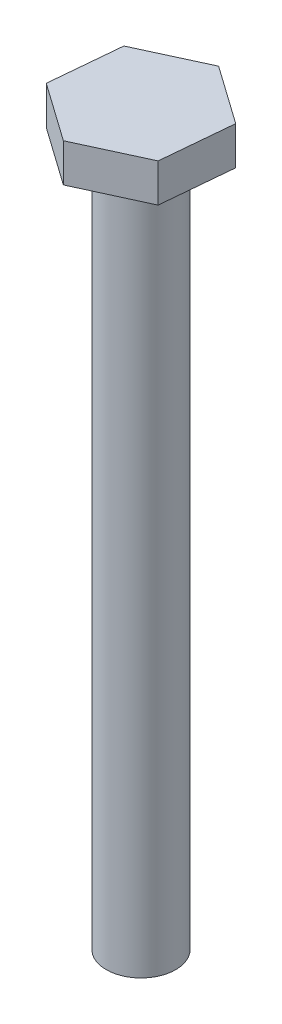
ISO-10303-21;
HEADER;
FILE_DESCRIPTION(('STEP AP214'),'2;1');
FILE_NAME('part.step','',(''),(''),'','','');
FILE_SCHEMA(('AUTOMOTIVE_DESIGN { 1 0 10303 214 1 1 1 1 }'));
ENDSEC;
DATA;
#1=APPLICATION_CONTEXT('core data for automotive mechanical design processes');
#2=APPLICATION_PROTOCOL_DEFINITION('international standard','automotive_design',2000,#1);
#3=PRODUCT_CONTEXT('',#1,'mechanical');
#4=PRODUCT('Part','Part','',(#3));
#5=PRODUCT_RELATED_PRODUCT_CATEGORY('part','',(#4));
#6=PRODUCT_DEFINITION_FORMATION('','',#4);
#7=PRODUCT_DEFINITION_CONTEXT('part definition',#1,'design');
#8=PRODUCT_DEFINITION('design','',#6,#7);
#9=PRODUCT_DEFINITION_SHAPE('','',#8);
#10=(LENGTH_UNIT() NAMED_UNIT(*) SI_UNIT(.MILLI.,.METRE.));
#11=(NAMED_UNIT(*) PLANE_ANGLE_UNIT() SI_UNIT($,.RADIAN.));
#12=(NAMED_UNIT(*) SI_UNIT($,.STERADIAN.) SOLID_ANGLE_UNIT());
#13=UNCERTAINTY_MEASURE_WITH_UNIT(LENGTH_MEASURE(1.E-05),#10,'distance_accuracy_value','');
#14=(GEOMETRIC_REPRESENTATION_CONTEXT(3) GLOBAL_UNCERTAINTY_ASSIGNED_CONTEXT((#13)) GLOBAL_UNIT_ASSIGNED_CONTEXT((#10,
#11,#12)) REPRESENTATION_CONTEXT('',''));
#15=CARTESIAN_POINT('',(0.,0.,0.));
#16=DIRECTION('',(0.,0.,1.));
#17=DIRECTION('',(1.,0.,0.));
#18=AXIS2_PLACEMENT_3D('',#15,#16,#17);
#19=CARTESIAN_POINT('',(0.,-127.,0.));
#20=DIRECTION('',(0.,1.,0.));
#21=DIRECTION('',(0.,0.,1.));
#22=AXIS2_PLACEMENT_3D('',#19,#20,#21);
#23=CYLINDRICAL_SURFACE('',#22,6.35);
#24=CARTESIAN_POINT('',(0.,-127.,0.));
#25=DIRECTION('',(0.,1.,0.));
#26=DIRECTION('',(0.,0.,1.));
#27=AXIS2_PLACEMENT_3D('',#24,#25,#26);
#28=CIRCLE('',#27,6.35);
#29=CARTESIAN_POINT('',(0.,-127.,6.35));
#30=VERTEX_POINT('',#29);
#31=EDGE_CURVE('E11',#30,#30,#28,.T.);
#32=ORIENTED_EDGE('',*,*,#31,.T.);
#33=EDGE_LOOP('',(#32));
#34=FACE_BOUND('',#33,.T.);
#35=CARTESIAN_POINT('',(0.,0.,0.));
#36=DIRECTION('',(0.,1.,0.));
#37=DIRECTION('',(0.,0.,1.));
#38=AXIS2_PLACEMENT_3D('',#35,#36,#37);
#39=CIRCLE('',#38,6.35);
#40=CARTESIAN_POINT('',(0.,0.,6.35));
#41=VERTEX_POINT('',#40);
#42=EDGE_CURVE('E40',#41,#41,#39,.T.);
#43=ORIENTED_EDGE('',*,*,#42,.F.);
#44=EDGE_LOOP('',(#43));
#45=FACE_BOUND('',#44,.T.);
#46=ADVANCED_FACE('F37',(#34,#45),#23,.T.);
#47=CARTESIAN_POINT('',(0.,-127.,0.));
#48=DIRECTION('',(0.,1.,0.));
#49=DIRECTION('',(0.,0.,1.));
#50=AXIS2_PLACEMENT_3D('',#47,#48,#49);
#51=PLANE('',#50);
#52=ORIENTED_EDGE('',*,*,#31,.F.);
#53=EDGE_LOOP('',(#52));
#54=FACE_BOUND('',#53,.T.);
#55=ADVANCED_FACE('F148',(#54),#51,.F.);
#56=CARTESIAN_POINT('',(-1.19320133421304,7.,13.));
#57=DIRECTION('',(-0.418751927777362,0.,-0.90810066786824));
#58=DIRECTION('',(-0.90810066786824,0.,0.418751927777362));
#59=AXIS2_PLACEMENT_3D('',#56,#57,#58);
#60=PLANE('',#59);
#61=DIRECTION('',(0.90810066786824,0.,-0.418751927777362));
#62=VECTOR('',#61,1.);
#63=CARTESIAN_POINT('',(-1.19320133421304,0.,13.));
#64=LINE('',#63,#62);
#65=CARTESIAN_POINT('',(-1.19320133421304,0.,13.));
#66=VERTEX_POINT('',#65);
#67=CARTESIAN_POINT('',(10.6617295820912,0.,7.53334266725798));
#68=VERTEX_POINT('',#67);
#69=EDGE_CURVE('E122',#66,#68,#64,.T.);
#70=ORIENTED_EDGE('',*,*,#69,.T.);
#71=DIRECTION('',(0.,-1.,0.));
#72=VECTOR('',#71,1.);
#73=CARTESIAN_POINT('',(10.6617295820912,7.,7.53334266725798));
#74=LINE('',#73,#72);
#75=CARTESIAN_POINT('',(10.6617295820912,7.,7.53334266725798));
#76=VERTEX_POINT('',#75);
#77=EDGE_CURVE('E139',#76,#68,#74,.T.);
#78=ORIENTED_EDGE('',*,*,#77,.F.);
#79=DIRECTION('',(0.90810066786824,0.,-0.418751927777362));
#80=VECTOR('',#79,1.);
#81=CARTESIAN_POINT('',(-1.19320133421304,7.,13.));
#82=LINE('',#81,#80);
#83=CARTESIAN_POINT('',(-1.19320133421304,7.,13.));
#84=VERTEX_POINT('',#83);
#85=EDGE_CURVE('E132',#84,#76,#82,.T.);
#86=ORIENTED_EDGE('',*,*,#85,.F.);
#87=DIRECTION('',(0.,-1.,0.));
#88=VECTOR('',#87,1.);
#89=CARTESIAN_POINT('',(-1.19320133421304,7.,13.));
#90=LINE('',#89,#88);
#91=EDGE_CURVE('E118',#84,#66,#90,.T.);
#92=ORIENTED_EDGE('',*,*,#91,.T.);
#93=EDGE_LOOP('',(#70,#78,#86,#92));
#94=FACE_BOUND('',#93,.T.);
#95=ADVANCED_FACE('F153',(#94),#60,.F.);
#96=CARTESIAN_POINT('',(10.6617295820912,7.,7.53334266725798));
#97=DIRECTION('',(-0.995814211456192,0.,-0.0914005265952182));
#98=DIRECTION('',(-0.0914005265952182,0.,0.995814211456192));
#99=AXIS2_PLACEMENT_3D('',#96,#97,#98);
#100=PLANE('',#99);
#101=DIRECTION('',(0.0914005265952182,0.,-0.995814211456192));
#102=VECTOR('',#101,1.);
#103=CARTESIAN_POINT('',(10.6617295820912,0.,7.53334266725798));
#104=LINE('',#103,#102);
#105=CARTESIAN_POINT('',(11.8549309163042,0.,-5.46665733274202));
#106=VERTEX_POINT('',#105);
#107=EDGE_CURVE('E125',#68,#106,#104,.T.);
#108=ORIENTED_EDGE('',*,*,#107,.T.);
#109=DIRECTION('',(0.,-1.,0.));
#110=VECTOR('',#109,1.);
#111=CARTESIAN_POINT('',(11.8549309163042,7.,-5.46665733274202));
#112=LINE('',#111,#110);
#113=CARTESIAN_POINT('',(11.8549309163042,7.,-5.46665733274202));
#114=VERTEX_POINT('',#113);
#115=EDGE_CURVE('E136',#114,#106,#112,.T.);
#116=ORIENTED_EDGE('',*,*,#115,.F.);
#117=DIRECTION('',(0.0914005265952182,0.,-0.995814211456192));
#118=VECTOR('',#117,1.);
#119=CARTESIAN_POINT('',(10.6617295820912,7.,7.53334266725798));
#120=LINE('',#119,#118);
#121=EDGE_CURVE('E91',#76,#114,#120,.T.);
#122=ORIENTED_EDGE('',*,*,#121,.F.);
#123=ORIENTED_EDGE('',*,*,#77,.T.);
#124=EDGE_LOOP('',(#108,#116,#122,#123));
#125=FACE_BOUND('',#124,.T.);
#126=ADVANCED_FACE('F159',(#125),#100,.F.);
#127=CARTESIAN_POINT('',(11.8549309163042,7.,-5.46665733274202));
#128=DIRECTION('',(-0.57706228367883,0.,0.816700141273021));
#129=DIRECTION('',(0.816700141273021,0.,0.57706228367883));
#130=AXIS2_PLACEMENT_3D('',#127,#128,#129);
#131=PLANE('',#130);
#132=DIRECTION('',(-0.816700141273022,0.,-0.57706228367883));
#133=VECTOR('',#132,1.);
#134=CARTESIAN_POINT('',(11.8549309163042,0.,-5.46665733274202));
#135=LINE('',#134,#133);
#136=CARTESIAN_POINT('',(1.19320133421305,0.,-13.));
#137=VERTEX_POINT('',#136);
#138=EDGE_CURVE('E127',#106,#137,#135,.T.);
#139=ORIENTED_EDGE('',*,*,#138,.T.);
#140=DIRECTION('',(0.,-1.,0.));
#141=VECTOR('',#140,1.);
#142=CARTESIAN_POINT('',(1.19320133421305,7.,-13.));
#143=LINE('',#142,#141);
#144=CARTESIAN_POINT('',(1.19320133421305,7.,-13.));
#145=VERTEX_POINT('',#144);
#146=EDGE_CURVE('E113',#145,#137,#143,.T.);
#147=ORIENTED_EDGE('',*,*,#146,.F.);
#148=DIRECTION('',(-0.816700141273022,0.,-0.57706228367883));
#149=VECTOR('',#148,1.);
#150=CARTESIAN_POINT('',(11.8549309163042,7.,-5.46665733274202));
#151=LINE('',#150,#149);
#152=EDGE_CURVE('E104',#114,#145,#151,.T.);
#153=ORIENTED_EDGE('',*,*,#152,.F.);
#154=ORIENTED_EDGE('',*,*,#115,.T.);
#155=EDGE_LOOP('',(#139,#147,#153,#154));
#156=FACE_BOUND('',#155,.T.);
#157=ADVANCED_FACE('F165',(#156),#131,.F.);
#158=CARTESIAN_POINT('',(1.19320133421305,7.,-13.));
#159=DIRECTION('',(0.418751927777362,0.,0.90810066786824));
#160=DIRECTION('',(0.90810066786824,0.,-0.418751927777362));
#161=AXIS2_PLACEMENT_3D('',#158,#159,#160);
#162=PLANE('',#161);
#163=DIRECTION('',(-0.90810066786824,0.,0.418751927777362));
#164=VECTOR('',#163,1.);
#165=CARTESIAN_POINT('',(1.19320133421305,0.,-13.));
#166=LINE('',#165,#164);
#167=CARTESIAN_POINT('',(-10.6617295820912,0.,-7.53334266725798));
#168=VERTEX_POINT('',#167);
#169=EDGE_CURVE('E112',#137,#168,#166,.T.);
#170=ORIENTED_EDGE('',*,*,#169,.T.);
#171=DIRECTION('',(0.,-1.,0.));
#172=VECTOR('',#171,1.);
#173=CARTESIAN_POINT('',(-10.6617295820912,7.,-7.53334266725798));
#174=LINE('',#173,#172);
#175=CARTESIAN_POINT('',(-10.6617295820912,7.,-7.53334266725798));
#176=VERTEX_POINT('',#175);
#177=EDGE_CURVE('E109',#176,#168,#174,.T.);
#178=ORIENTED_EDGE('',*,*,#177,.F.);
#179=DIRECTION('',(-0.90810066786824,0.,0.418751927777362));
#180=VECTOR('',#179,1.);
#181=CARTESIAN_POINT('',(1.19320133421305,7.,-13.));
#182=LINE('',#181,#180);
#183=EDGE_CURVE('E98',#145,#176,#182,.T.);
#184=ORIENTED_EDGE('',*,*,#183,.F.);
#185=ORIENTED_EDGE('',*,*,#146,.T.);
#186=EDGE_LOOP('',(#170,#178,#184,#185));
#187=FACE_BOUND('',#186,.T.);
#188=ADVANCED_FACE('F110',(#187),#162,.F.);
#189=CARTESIAN_POINT('',(-10.6617295820912,7.,-7.53334266725798));
#190=DIRECTION('',(0.995814211456192,0.,0.0914005265952182));
#191=DIRECTION('',(0.0914005265952182,0.,-0.995814211456192));
#192=AXIS2_PLACEMENT_3D('',#189,#190,#191);
#193=PLANE('',#192);
#194=DIRECTION('',(-0.0914005265952182,0.,0.995814211456192));
#195=VECTOR('',#194,1.);
#196=CARTESIAN_POINT('',(-10.6617295820912,0.,-7.53334266725798));
#197=LINE('',#196,#195);
#198=CARTESIAN_POINT('',(-11.8549309163042,0.,5.46665733274202));
#199=VERTEX_POINT('',#198);
#200=EDGE_CURVE('E76',#168,#199,#197,.T.);
#201=ORIENTED_EDGE('',*,*,#200,.T.);
#202=DIRECTION('',(0.,-1.,0.));
#203=VECTOR('',#202,1.);
#204=CARTESIAN_POINT('',(-11.8549309163042,7.,5.46665733274202));
#205=LINE('',#204,#203);
#206=CARTESIAN_POINT('',(-11.8549309163042,7.,5.46665733274202));
#207=VERTEX_POINT('',#206);
#208=EDGE_CURVE('E114',#207,#199,#205,.T.);
#209=ORIENTED_EDGE('',*,*,#208,.F.);
#210=DIRECTION('',(-0.0914005265952182,0.,0.995814211456192));
#211=VECTOR('',#210,1.);
#212=CARTESIAN_POINT('',(-10.6617295820912,7.,-7.53334266725798));
#213=LINE('',#212,#211);
#214=EDGE_CURVE('E102',#176,#207,#213,.T.);
#215=ORIENTED_EDGE('',*,*,#214,.F.);
#216=ORIENTED_EDGE('',*,*,#177,.T.);
#217=EDGE_LOOP('',(#201,#209,#215,#216));
#218=FACE_BOUND('',#217,.T.);
#219=ADVANCED_FACE('F116',(#218),#193,.F.);
#220=CARTESIAN_POINT('',(-11.8549309163042,7.,5.46665733274202));
#221=DIRECTION('',(0.57706228367883,0.,-0.816700141273021));
#222=DIRECTION('',(-0.816700141273022,0.,-0.57706228367883));
#223=AXIS2_PLACEMENT_3D('',#220,#221,#222);
#224=PLANE('',#223);
#225=DIRECTION('',(0.816700141273022,0.,0.57706228367883));
#226=VECTOR('',#225,1.);
#227=CARTESIAN_POINT('',(-11.8549309163042,0.,5.46665733274202));
#228=LINE('',#227,#226);
#229=EDGE_CURVE('E82',#199,#66,#228,.T.);
#230=ORIENTED_EDGE('',*,*,#229,.T.);
#231=ORIENTED_EDGE('',*,*,#91,.F.);
#232=DIRECTION('',(0.816700141273022,0.,0.57706228367883));
#233=VECTOR('',#232,1.);
#234=CARTESIAN_POINT('',(-11.8549309163042,7.,5.46665733274202));
#235=LINE('',#234,#233);
#236=EDGE_CURVE('E53',#207,#84,#235,.T.);
#237=ORIENTED_EDGE('',*,*,#236,.F.);
#238=ORIENTED_EDGE('',*,*,#208,.T.);
#239=EDGE_LOOP('',(#230,#231,#237,#238));
#240=FACE_BOUND('',#239,.T.);
#241=ADVANCED_FACE('F173',(#240),#224,.F.);
#242=CARTESIAN_POINT('',(0.,7.,0.));
#243=DIRECTION('',(0.,1.,0.));
#244=DIRECTION('',(0.,0.,1.));
#245=AXIS2_PLACEMENT_3D('',#242,#243,#244);
#246=PLANE('',#245);
#247=ORIENTED_EDGE('',*,*,#85,.T.);
#248=ORIENTED_EDGE('',*,*,#121,.T.);
#249=ORIENTED_EDGE('',*,*,#152,.T.);
#250=ORIENTED_EDGE('',*,*,#183,.T.);
#251=ORIENTED_EDGE('',*,*,#214,.T.);
#252=ORIENTED_EDGE('',*,*,#236,.T.);
#253=EDGE_LOOP('',(#247,#248,#249,#250,#251,#252));
#254=FACE_BOUND('',#253,.T.);
#255=ADVANCED_FACE('F100',(#254),#246,.T.);
#256=CARTESIAN_POINT('',(0.,0.,0.));
#257=DIRECTION('',(0.,1.,0.));
#258=DIRECTION('',(0.,0.,1.));
#259=AXIS2_PLACEMENT_3D('',#256,#257,#258);
#260=PLANE('',#259);
#261=ORIENTED_EDGE('',*,*,#42,.T.);
#262=EDGE_LOOP('',(#261));
#263=FACE_BOUND('',#262,.T.);
#264=ORIENTED_EDGE('',*,*,#69,.F.);
#265=ORIENTED_EDGE('',*,*,#229,.F.);
#266=ORIENTED_EDGE('',*,*,#200,.F.);
#267=ORIENTED_EDGE('',*,*,#169,.F.);
#268=ORIENTED_EDGE('',*,*,#138,.F.);
#269=ORIENTED_EDGE('',*,*,#107,.F.);
#270=EDGE_LOOP('',(#264,#265,#266,#267,#268,#269));
#271=FACE_BOUND('',#270,.T.);
#272=ADVANCED_FACE('F144',(#263,#271),#260,.F.);
#273=CLOSED_SHELL('',(#46,#55,#95,#126,#157,#188,#219,#241,#255,#272));
#274=MANIFOLD_SOLID_BREP('B2',#273);
#275=ADVANCED_BREP_SHAPE_REPRESENTATION('',(#18,#274),#14);
#276=SHAPE_DEFINITION_REPRESENTATION(#9,#275);
ENDSEC;
END-ISO-10303-21;
